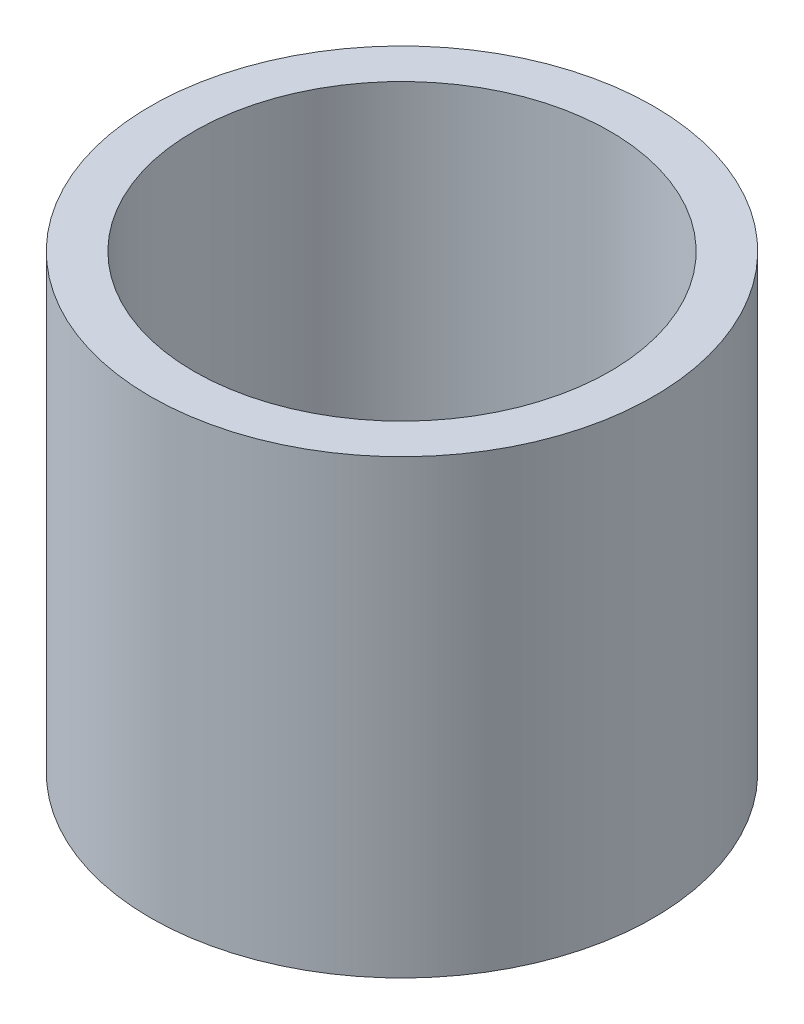
ISO-10303-21;
HEADER;
FILE_DESCRIPTION(('STEP AP214'),'2;1');
FILE_NAME('part.step','',(''),(''),'','','');
FILE_SCHEMA(('AUTOMOTIVE_DESIGN { 1 0 10303 214 1 1 1 1 }'));
ENDSEC;
DATA;
#1=APPLICATION_CONTEXT('core data for automotive mechanical design processes');
#2=APPLICATION_PROTOCOL_DEFINITION('international standard','automotive_design',2000,#1);
#3=PRODUCT_CONTEXT('',#1,'mechanical');
#4=PRODUCT('Part','Part','',(#3));
#5=PRODUCT_RELATED_PRODUCT_CATEGORY('part','',(#4));
#6=PRODUCT_DEFINITION_FORMATION('','',#4);
#7=PRODUCT_DEFINITION_CONTEXT('part definition',#1,'design');
#8=PRODUCT_DEFINITION('design','',#6,#7);
#9=PRODUCT_DEFINITION_SHAPE('','',#8);
#10=(LENGTH_UNIT() NAMED_UNIT(*) SI_UNIT(.MILLI.,.METRE.));
#11=(NAMED_UNIT(*) PLANE_ANGLE_UNIT() SI_UNIT($,.RADIAN.));
#12=(NAMED_UNIT(*) SI_UNIT($,.STERADIAN.) SOLID_ANGLE_UNIT());
#13=UNCERTAINTY_MEASURE_WITH_UNIT(LENGTH_MEASURE(1.E-05),#10,'distance_accuracy_value','');
#14=(GEOMETRIC_REPRESENTATION_CONTEXT(3) GLOBAL_UNCERTAINTY_ASSIGNED_CONTEXT((#13)) GLOBAL_UNIT_ASSIGNED_CONTEXT((#10,
#11,#12)) REPRESENTATION_CONTEXT('',''));
#15=CARTESIAN_POINT('',(0.,0.,0.));
#16=DIRECTION('',(0.,0.,1.));
#17=DIRECTION('',(1.,0.,0.));
#18=AXIS2_PLACEMENT_3D('',#15,#16,#17);
#19=CARTESIAN_POINT('',(0.,7.,0.));
#20=DIRECTION('',(0.,1.,0.));
#21=DIRECTION('',(0.,0.,1.));
#22=AXIS2_PLACEMENT_3D('',#19,#20,#21);
#23=PLANE('',#22);
#24=CARTESIAN_POINT('',(0.,7.,0.));
#25=DIRECTION('',(0.,1.,0.));
#26=DIRECTION('',(0.,0.,1.));
#27=AXIS2_PLACEMENT_3D('',#24,#25,#26);
#28=CIRCLE('',#27,3.9);
#29=CARTESIAN_POINT('',(0.,7.,3.9));
#30=VERTEX_POINT('',#29);
#31=EDGE_CURVE('E10',#30,#30,#28,.T.);
#32=ORIENTED_EDGE('',*,*,#31,.T.);
#33=EDGE_LOOP('',(#32));
#34=FACE_BOUND('',#33,.T.);
#35=CARTESIAN_POINT('',(0.,7.,0.));
#36=DIRECTION('',(0.,1.,0.));
#37=DIRECTION('',(0.,0.,1.));
#38=AXIS2_PLACEMENT_3D('',#35,#36,#37);
#39=CIRCLE('',#38,3.225);
#40=CARTESIAN_POINT('',(0.,7.,3.225));
#41=VERTEX_POINT('',#40);
#42=EDGE_CURVE('E47',#41,#41,#39,.T.);
#43=ORIENTED_EDGE('',*,*,#42,.F.);
#44=EDGE_LOOP('',(#43));
#45=FACE_BOUND('',#44,.T.);
#46=ADVANCED_FACE('F36',(#34,#45),#23,.T.);
#47=CARTESIAN_POINT('',(0.,0.,0.));
#48=DIRECTION('',(0.,1.,0.));
#49=DIRECTION('',(0.,0.,1.));
#50=AXIS2_PLACEMENT_3D('',#47,#48,#49);
#51=PLANE('',#50);
#52=CARTESIAN_POINT('',(0.,0.,0.));
#53=DIRECTION('',(0.,1.,0.));
#54=DIRECTION('',(0.,0.,1.));
#55=AXIS2_PLACEMENT_3D('',#52,#53,#54);
#56=CIRCLE('',#55,3.9);
#57=CARTESIAN_POINT('',(0.,0.,3.9));
#58=VERTEX_POINT('',#57);
#59=EDGE_CURVE('E40',#58,#58,#56,.T.);
#60=ORIENTED_EDGE('',*,*,#59,.F.);
#61=EDGE_LOOP('',(#60));
#62=FACE_BOUND('',#61,.T.);
#63=CARTESIAN_POINT('',(0.,0.,0.));
#64=DIRECTION('',(0.,1.,0.));
#65=DIRECTION('',(0.,0.,1.));
#66=AXIS2_PLACEMENT_3D('',#63,#64,#65);
#67=CIRCLE('',#66,3.225);
#68=CARTESIAN_POINT('',(0.,0.,3.225));
#69=VERTEX_POINT('',#68);
#70=EDGE_CURVE('E49',#69,#69,#67,.T.);
#71=ORIENTED_EDGE('',*,*,#70,.T.);
#72=EDGE_LOOP('',(#71));
#73=FACE_BOUND('',#72,.T.);
#74=ADVANCED_FACE('F59',(#62,#73),#51,.F.);
#75=CARTESIAN_POINT('',(0.,7.,0.));
#76=DIRECTION('',(0.,-1.,0.));
#77=DIRECTION('',(0.,0.,-1.));
#78=AXIS2_PLACEMENT_3D('',#75,#76,#77);
#79=CYLINDRICAL_SURFACE('',#78,3.9);
#80=ORIENTED_EDGE('',*,*,#31,.F.);
#81=EDGE_LOOP('',(#80));
#82=FACE_BOUND('',#81,.T.);
#83=ORIENTED_EDGE('',*,*,#59,.T.);
#84=EDGE_LOOP('',(#83));
#85=FACE_BOUND('',#84,.T.);
#86=ADVANCED_FACE('F38',(#82,#85),#79,.T.);
#87=CARTESIAN_POINT('',(0.,7.,0.));
#88=DIRECTION('',(0.,-1.,0.));
#89=DIRECTION('',(0.,0.,-1.));
#90=AXIS2_PLACEMENT_3D('',#87,#88,#89);
#91=CYLINDRICAL_SURFACE('',#90,3.225);
#92=ORIENTED_EDGE('',*,*,#42,.T.);
#93=EDGE_LOOP('',(#92));
#94=FACE_BOUND('',#93,.T.);
#95=ORIENTED_EDGE('',*,*,#70,.F.);
#96=EDGE_LOOP('',(#95));
#97=FACE_BOUND('',#96,.T.);
#98=ADVANCED_FACE('F55',(#94,#97),#91,.F.);
#99=CLOSED_SHELL('',(#46,#74,#86,#98));
#100=MANIFOLD_SOLID_BREP('B2',#99);
#101=ADVANCED_BREP_SHAPE_REPRESENTATION('',(#18,#100),#14);
#102=SHAPE_DEFINITION_REPRESENTATION(#9,#101);
ENDSEC;
END-ISO-10303-21;
